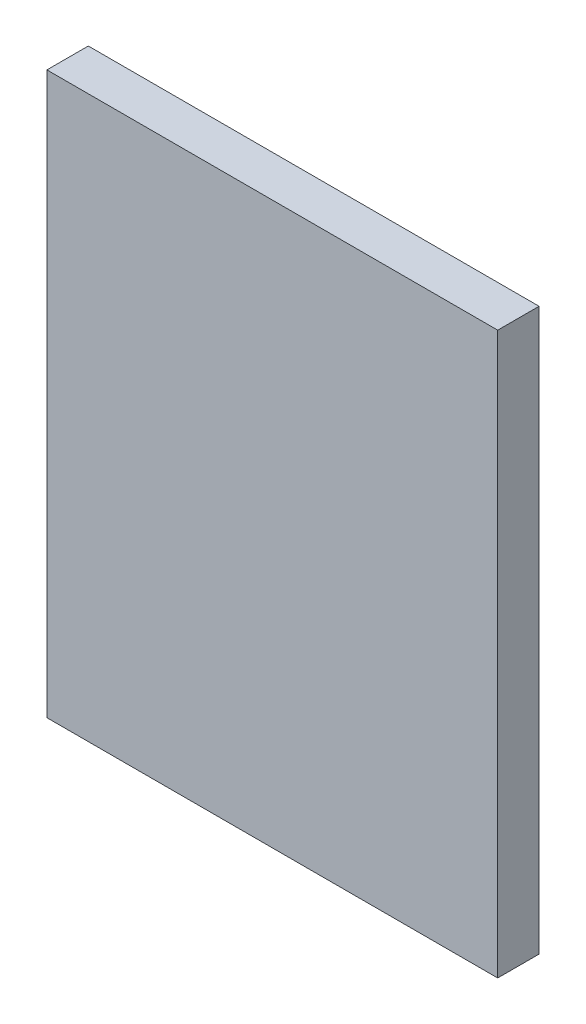
ISO-10303-21;
HEADER;
FILE_DESCRIPTION(('STEP AP214'),'2;1');
FILE_NAME('part.step','',(''),(''),'','','');
FILE_SCHEMA(('AUTOMOTIVE_DESIGN { 1 0 10303 214 1 1 1 1 }'));
ENDSEC;
DATA;
#1=APPLICATION_CONTEXT('core data for automotive mechanical design processes');
#2=APPLICATION_PROTOCOL_DEFINITION('international standard','automotive_design',2000,#1);
#3=PRODUCT_CONTEXT('',#1,'mechanical');
#4=PRODUCT('Part','Part','',(#3));
#5=PRODUCT_RELATED_PRODUCT_CATEGORY('part','',(#4));
#6=PRODUCT_DEFINITION_FORMATION('','',#4);
#7=PRODUCT_DEFINITION_CONTEXT('part definition',#1,'design');
#8=PRODUCT_DEFINITION('design','',#6,#7);
#9=PRODUCT_DEFINITION_SHAPE('','',#8);
#10=(LENGTH_UNIT() NAMED_UNIT(*) SI_UNIT(.MILLI.,.METRE.));
#11=(NAMED_UNIT(*) PLANE_ANGLE_UNIT() SI_UNIT($,.RADIAN.));
#12=(NAMED_UNIT(*) SI_UNIT($,.STERADIAN.) SOLID_ANGLE_UNIT());
#13=UNCERTAINTY_MEASURE_WITH_UNIT(LENGTH_MEASURE(1.E-05),#10,'distance_accuracy_value','');
#14=(GEOMETRIC_REPRESENTATION_CONTEXT(3) GLOBAL_UNCERTAINTY_ASSIGNED_CONTEXT((#13)) GLOBAL_UNIT_ASSIGNED_CONTEXT((#10,
#11,#12)) REPRESENTATION_CONTEXT('',''));
#15=CARTESIAN_POINT('',(0.,0.,0.));
#16=DIRECTION('',(0.,0.,1.));
#17=DIRECTION('',(1.,0.,0.));
#18=AXIS2_PLACEMENT_3D('',#15,#16,#17);
#19=CARTESIAN_POINT('',(-20.4076627712903,13.2204758585085,1.6));
#20=DIRECTION('',(1.,0.,0.));
#21=DIRECTION('',(0.,1.,0.));
#22=AXIS2_PLACEMENT_3D('',#19,#20,#21);
#23=PLANE('',#22);
#24=DIRECTION('',(0.,-1.,0.));
#25=VECTOR('',#24,1.);
#26=CARTESIAN_POINT('',(-20.4076627712903,13.2204758585085,0.));
#27=LINE('',#26,#25);
#28=CARTESIAN_POINT('',(-20.4076627712903,13.2204758585085,0.));
#29=VERTEX_POINT('',#28);
#30=CARTESIAN_POINT('',(-20.4076627712903,-8.47552414149147,0.));
#31=VERTEX_POINT('',#30);
#32=EDGE_CURVE('E95',#29,#31,#27,.T.);
#33=ORIENTED_EDGE('',*,*,#32,.T.);
#34=DIRECTION('',(0.,0.,-1.));
#35=VECTOR('',#34,1.);
#36=CARTESIAN_POINT('',(-20.4076627712903,-8.47552414149147,1.6));
#37=LINE('',#36,#35);
#38=CARTESIAN_POINT('',(-20.4076627712903,-8.47552414149147,1.6));
#39=VERTEX_POINT('',#38);
#40=EDGE_CURVE('E11',#39,#31,#37,.T.);
#41=ORIENTED_EDGE('',*,*,#40,.F.);
#42=DIRECTION('',(0.,-1.,0.));
#43=VECTOR('',#42,1.);
#44=CARTESIAN_POINT('',(-20.4076627712903,13.2204758585085,1.6));
#45=LINE('',#44,#43);
#46=CARTESIAN_POINT('',(-20.4076627712903,13.2204758585085,1.6));
#47=VERTEX_POINT('',#46);
#48=EDGE_CURVE('E83',#47,#39,#45,.T.);
#49=ORIENTED_EDGE('',*,*,#48,.F.);
#50=DIRECTION('',(0.,0.,-1.));
#51=VECTOR('',#50,1.);
#52=CARTESIAN_POINT('',(-20.4076627712903,13.2204758585085,1.6));
#53=LINE('',#52,#51);
#54=EDGE_CURVE('E91',#47,#29,#53,.T.);
#55=ORIENTED_EDGE('',*,*,#54,.T.);
#56=EDGE_LOOP('',(#33,#41,#49,#55));
#57=FACE_BOUND('',#56,.T.);
#58=ADVANCED_FACE('F32',(#57),#23,.F.);
#59=CARTESIAN_POINT('',(-20.4076627712903,-8.47552414149147,1.6));
#60=DIRECTION('',(0.,1.,0.));
#61=DIRECTION('',(0.,0.,1.));
#62=AXIS2_PLACEMENT_3D('',#59,#60,#61);
#63=PLANE('',#62);
#64=DIRECTION('',(1.,0.,0.));
#65=VECTOR('',#64,1.);
#66=CARTESIAN_POINT('',(-20.4076627712903,-8.47552414149147,0.));
#67=LINE('',#66,#65);
#68=CARTESIAN_POINT('',(-2.97566277129034,-8.47552414149147,0.));
#69=VERTEX_POINT('',#68);
#70=EDGE_CURVE('E87',#31,#69,#67,.T.);
#71=ORIENTED_EDGE('',*,*,#70,.T.);
#72=DIRECTION('',(0.,0.,-1.));
#73=VECTOR('',#72,1.);
#74=CARTESIAN_POINT('',(-2.97566277129034,-8.47552414149147,1.6));
#75=LINE('',#74,#73);
#76=CARTESIAN_POINT('',(-2.97566277129034,-8.47552414149147,1.6));
#77=VERTEX_POINT('',#76);
#78=EDGE_CURVE('E40',#77,#69,#75,.T.);
#79=ORIENTED_EDGE('',*,*,#78,.F.);
#80=DIRECTION('',(1.,0.,0.));
#81=VECTOR('',#80,1.);
#82=CARTESIAN_POINT('',(-20.4076627712903,-8.47552414149147,1.6));
#83=LINE('',#82,#81);
#84=EDGE_CURVE('E78',#39,#77,#83,.T.);
#85=ORIENTED_EDGE('',*,*,#84,.F.);
#86=ORIENTED_EDGE('',*,*,#40,.T.);
#87=EDGE_LOOP('',(#71,#79,#85,#86));
#88=FACE_BOUND('',#87,.T.);
#89=ADVANCED_FACE('F86',(#88),#63,.F.);
#90=CARTESIAN_POINT('',(-2.97566277129034,13.2204758585085,1.6));
#91=DIRECTION('',(-1.,0.,0.));
#92=DIRECTION('',(0.,-1.,0.));
#93=AXIS2_PLACEMENT_3D('',#90,#91,#92);
#94=PLANE('',#93);
#95=DIRECTION('',(0.,1.,0.));
#96=VECTOR('',#95,1.);
#97=CARTESIAN_POINT('',(-2.97566277129034,13.2204758585085,0.));
#98=LINE('',#97,#96);
#99=CARTESIAN_POINT('',(-2.97566277129034,13.2204758585085,0.));
#100=VERTEX_POINT('',#99);
#101=EDGE_CURVE('E65',#69,#100,#98,.T.);
#102=ORIENTED_EDGE('',*,*,#101,.T.);
#103=DIRECTION('',(0.,0.,-1.));
#104=VECTOR('',#103,1.);
#105=CARTESIAN_POINT('',(-2.97566277129034,13.2204758585085,1.6));
#106=LINE('',#105,#104);
#107=CARTESIAN_POINT('',(-2.97566277129034,13.2204758585085,1.6));
#108=VERTEX_POINT('',#107);
#109=EDGE_CURVE('E88',#108,#100,#106,.T.);
#110=ORIENTED_EDGE('',*,*,#109,.F.);
#111=DIRECTION('',(0.,1.,0.));
#112=VECTOR('',#111,1.);
#113=CARTESIAN_POINT('',(-2.97566277129034,13.2204758585085,1.6));
#114=LINE('',#113,#112);
#115=EDGE_CURVE('E81',#77,#108,#114,.T.);
#116=ORIENTED_EDGE('',*,*,#115,.F.);
#117=ORIENTED_EDGE('',*,*,#78,.T.);
#118=EDGE_LOOP('',(#102,#110,#116,#117));
#119=FACE_BOUND('',#118,.T.);
#120=ADVANCED_FACE('F89',(#119),#94,.F.);
#121=CARTESIAN_POINT('',(-20.4076627712903,13.2204758585085,1.6));
#122=DIRECTION('',(0.,-1.,0.));
#123=DIRECTION('',(0.,0.,-1.));
#124=AXIS2_PLACEMENT_3D('',#121,#122,#123);
#125=PLANE('',#124);
#126=DIRECTION('',(-1.,0.,0.));
#127=VECTOR('',#126,1.);
#128=CARTESIAN_POINT('',(-20.4076627712903,13.2204758585085,0.));
#129=LINE('',#128,#127);
#130=EDGE_CURVE('E71',#100,#29,#129,.T.);
#131=ORIENTED_EDGE('',*,*,#130,.T.);
#132=ORIENTED_EDGE('',*,*,#54,.F.);
#133=DIRECTION('',(-1.,0.,0.));
#134=VECTOR('',#133,1.);
#135=CARTESIAN_POINT('',(-20.4076627712903,13.2204758585085,1.6));
#136=LINE('',#135,#134);
#137=EDGE_CURVE('E48',#108,#47,#136,.T.);
#138=ORIENTED_EDGE('',*,*,#137,.F.);
#139=ORIENTED_EDGE('',*,*,#109,.T.);
#140=EDGE_LOOP('',(#131,#132,#138,#139));
#141=FACE_BOUND('',#140,.T.);
#142=ADVANCED_FACE('F102',(#141),#125,.F.);
#143=CARTESIAN_POINT('',(0.,0.,1.6));
#144=DIRECTION('',(0.,0.,1.));
#145=DIRECTION('',(1.,0.,0.));
#146=AXIS2_PLACEMENT_3D('',#143,#144,#145);
#147=PLANE('',#146);
#148=ORIENTED_EDGE('',*,*,#48,.T.);
#149=ORIENTED_EDGE('',*,*,#84,.T.);
#150=ORIENTED_EDGE('',*,*,#115,.T.);
#151=ORIENTED_EDGE('',*,*,#137,.T.);
#152=EDGE_LOOP('',(#148,#149,#150,#151));
#153=FACE_BOUND('',#152,.T.);
#154=ADVANCED_FACE('F79',(#153),#147,.T.);
#155=CARTESIAN_POINT('',(0.,0.,0.));
#156=DIRECTION('',(0.,0.,1.));
#157=DIRECTION('',(1.,0.,0.));
#158=AXIS2_PLACEMENT_3D('',#155,#156,#157);
#159=PLANE('',#158);
#160=ORIENTED_EDGE('',*,*,#32,.F.);
#161=ORIENTED_EDGE('',*,*,#130,.F.);
#162=ORIENTED_EDGE('',*,*,#101,.F.);
#163=ORIENTED_EDGE('',*,*,#70,.F.);
#164=EDGE_LOOP('',(#160,#161,#162,#163));
#165=FACE_BOUND('',#164,.T.);
#166=ADVANCED_FACE('F105',(#165),#159,.F.);
#167=CLOSED_SHELL('',(#58,#89,#120,#142,#154,#166));
#168=MANIFOLD_SOLID_BREP('B2',#167);
#169=ADVANCED_BREP_SHAPE_REPRESENTATION('',(#18,#168),#14);
#170=SHAPE_DEFINITION_REPRESENTATION(#9,#169);
ENDSEC;
END-ISO-10303-21;
